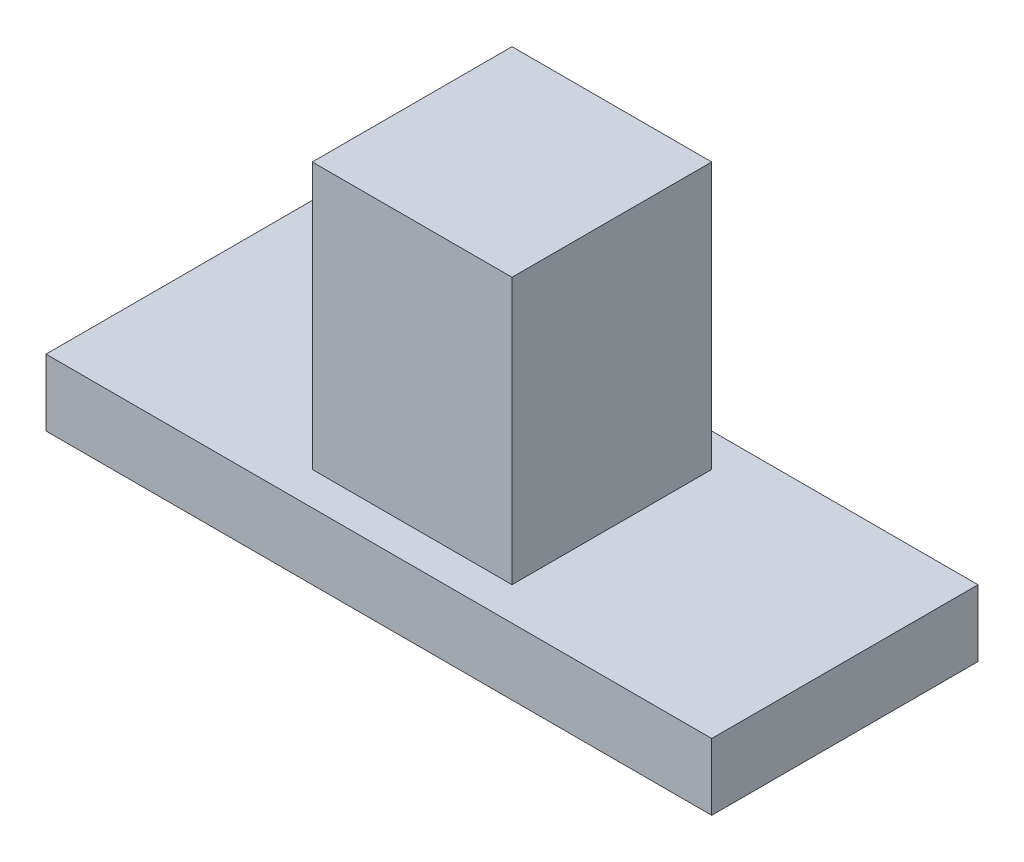
ISO-10303-21;
HEADER;
FILE_DESCRIPTION(('STEP AP214'),'2;1');
FILE_NAME('part.step','',(''),(''),'','','');
FILE_SCHEMA(('AUTOMOTIVE_DESIGN { 1 0 10303 214 1 1 1 1 }'));
ENDSEC;
DATA;
#1=APPLICATION_CONTEXT('core data for automotive mechanical design processes');
#2=APPLICATION_PROTOCOL_DEFINITION('international standard','automotive_design',2000,#1);
#3=PRODUCT_CONTEXT('',#1,'mechanical');
#4=PRODUCT('Part','Part','',(#3));
#5=PRODUCT_RELATED_PRODUCT_CATEGORY('part','',(#4));
#6=PRODUCT_DEFINITION_FORMATION('','',#4);
#7=PRODUCT_DEFINITION_CONTEXT('part definition',#1,'design');
#8=PRODUCT_DEFINITION('design','',#6,#7);
#9=PRODUCT_DEFINITION_SHAPE('','',#8);
#10=(LENGTH_UNIT() NAMED_UNIT(*) SI_UNIT(.MILLI.,.METRE.));
#11=(NAMED_UNIT(*) PLANE_ANGLE_UNIT() SI_UNIT($,.RADIAN.));
#12=(NAMED_UNIT(*) SI_UNIT($,.STERADIAN.) SOLID_ANGLE_UNIT());
#13=UNCERTAINTY_MEASURE_WITH_UNIT(LENGTH_MEASURE(1.E-05),#10,'distance_accuracy_value','');
#14=(GEOMETRIC_REPRESENTATION_CONTEXT(3) GLOBAL_UNCERTAINTY_ASSIGNED_CONTEXT((#13)) GLOBAL_UNIT_ASSIGNED_CONTEXT((#10,
#11,#12)) REPRESENTATION_CONTEXT('',''));
#15=CARTESIAN_POINT('',(0.,0.,0.));
#16=DIRECTION('',(0.,0.,1.));
#17=DIRECTION('',(1.,0.,0.));
#18=AXIS2_PLACEMENT_3D('',#15,#16,#17);
#19=CARTESIAN_POINT('',(0.,-1.,0.));
#20=DIRECTION('',(0.,-1.,0.));
#21=DIRECTION('',(0.,0.,-1.));
#22=AXIS2_PLACEMENT_3D('',#19,#20,#21);
#23=PLANE('',#22);
#24=DIRECTION('',(0.,0.,-1.));
#25=VECTOR('',#24,1.);
#26=CARTESIAN_POINT('',(-0.85,-1.,0.85));
#27=LINE('',#26,#25);
#28=CARTESIAN_POINT('',(-0.85,-1.,0.85));
#29=VERTEX_POINT('',#28);
#30=CARTESIAN_POINT('',(-0.849999999999999,-1.,-0.85));
#31=VERTEX_POINT('',#30);
#32=EDGE_CURVE('E50',#29,#31,#27,.T.);
#33=ORIENTED_EDGE('',*,*,#32,.F.);
#34=DIRECTION('',(-1.,0.,0.));
#35=VECTOR('',#34,1.);
#36=CARTESIAN_POINT('',(-0.85,-1.,0.85));
#37=LINE('',#36,#35);
#38=CARTESIAN_POINT('',(0.85,-1.,0.85));
#39=VERTEX_POINT('',#38);
#40=EDGE_CURVE('E143',#39,#29,#37,.T.);
#41=ORIENTED_EDGE('',*,*,#40,.F.);
#42=DIRECTION('',(0.,0.,1.));
#43=VECTOR('',#42,1.);
#44=CARTESIAN_POINT('',(0.85,-1.,0.85));
#45=LINE('',#44,#43);
#46=CARTESIAN_POINT('',(0.85,-1.,-0.85));
#47=VERTEX_POINT('',#46);
#48=EDGE_CURVE('E146',#47,#39,#45,.T.);
#49=ORIENTED_EDGE('',*,*,#48,.F.);
#50=DIRECTION('',(1.,0.,0.));
#51=VECTOR('',#50,1.);
#52=CARTESIAN_POINT('',(-0.849999999999999,-1.,-0.85));
#53=LINE('',#52,#51);
#54=EDGE_CURVE('E152',#31,#47,#53,.T.);
#55=ORIENTED_EDGE('',*,*,#54,.F.);
#56=EDGE_LOOP('',(#33,#41,#49,#55));
#57=FACE_BOUND('',#56,.T.);
#58=DIRECTION('',(0.,0.,-1.));
#59=VECTOR('',#58,1.);
#60=CARTESIAN_POINT('',(-5.,-1.,2.));
#61=LINE('',#60,#59);
#62=CARTESIAN_POINT('',(-5.,-1.,2.));
#63=VERTEX_POINT('',#62);
#64=CARTESIAN_POINT('',(-5.,-1.,-2.));
#65=VERTEX_POINT('',#64);
#66=EDGE_CURVE('E192',#63,#65,#61,.T.);
#67=ORIENTED_EDGE('',*,*,#66,.T.);
#68=DIRECTION('',(1.,0.,0.));
#69=VECTOR('',#68,1.);
#70=CARTESIAN_POINT('',(-5.,-1.,-2.));
#71=LINE('',#70,#69);
#72=CARTESIAN_POINT('',(5.,-1.,-2.));
#73=VERTEX_POINT('',#72);
#74=EDGE_CURVE('E195',#65,#73,#71,.T.);
#75=ORIENTED_EDGE('',*,*,#74,.T.);
#76=DIRECTION('',(0.,0.,1.));
#77=VECTOR('',#76,1.);
#78=CARTESIAN_POINT('',(5.,-1.,2.));
#79=LINE('',#78,#77);
#80=CARTESIAN_POINT('',(5.,-1.,2.));
#81=VERTEX_POINT('',#80);
#82=EDGE_CURVE('E198',#73,#81,#79,.T.);
#83=ORIENTED_EDGE('',*,*,#82,.T.);
#84=DIRECTION('',(-1.,0.,0.));
#85=VECTOR('',#84,1.);
#86=CARTESIAN_POINT('',(-5.,-1.,2.));
#87=LINE('',#86,#85);
#88=EDGE_CURVE('E201',#81,#63,#87,.T.);
#89=ORIENTED_EDGE('',*,*,#88,.T.);
#90=EDGE_LOOP('',(#67,#75,#83,#89));
#91=FACE_BOUND('',#90,.T.);
#92=ADVANCED_FACE('F35',(#57,#91),#23,.T.);
#93=CARTESIAN_POINT('',(-1.5,1.,-1.5));
#94=DIRECTION('',(1.,0.,0.));
#95=DIRECTION('',(0.,0.,-1.));
#96=AXIS2_PLACEMENT_3D('',#93,#94,#95);
#97=PLANE('',#96);
#98=DIRECTION('',(0.,-1.,0.));
#99=VECTOR('',#98,1.);
#100=CARTESIAN_POINT('',(-1.5,1.,-1.5));
#101=LINE('',#100,#99);
#102=CARTESIAN_POINT('',(-1.5,4.,-1.5));
#103=VERTEX_POINT('',#102);
#104=CARTESIAN_POINT('',(-1.5,0.,-1.5));
#105=VERTEX_POINT('',#104);
#106=EDGE_CURVE('E211',#103,#105,#101,.T.);
#107=ORIENTED_EDGE('',*,*,#106,.T.);
#108=DIRECTION('',(0.,0.,1.));
#109=VECTOR('',#108,1.);
#110=CARTESIAN_POINT('',(-1.5,0.,-1.5));
#111=LINE('',#110,#109);
#112=CARTESIAN_POINT('',(-1.5,0.,1.5));
#113=VERTEX_POINT('',#112);
#114=EDGE_CURVE('E179',#105,#113,#111,.T.);
#115=ORIENTED_EDGE('',*,*,#114,.T.);
#116=DIRECTION('',(0.,-1.,0.));
#117=VECTOR('',#116,1.);
#118=CARTESIAN_POINT('',(-1.5,1.,1.5));
#119=LINE('',#118,#117);
#120=CARTESIAN_POINT('',(-1.5,4.,1.5));
#121=VERTEX_POINT('',#120);
#122=EDGE_CURVE('E11',#121,#113,#119,.T.);
#123=ORIENTED_EDGE('',*,*,#122,.F.);
#124=DIRECTION('',(0.,0.,1.));
#125=VECTOR('',#124,1.);
#126=CARTESIAN_POINT('',(-1.5,4.,-1.5));
#127=LINE('',#126,#125);
#128=EDGE_CURVE('E158',#103,#121,#127,.T.);
#129=ORIENTED_EDGE('',*,*,#128,.F.);
#130=EDGE_LOOP('',(#107,#115,#123,#129));
#131=FACE_BOUND('',#130,.T.);
#132=ADVANCED_FACE('F229',(#131),#97,.F.);
#133=CARTESIAN_POINT('',(-1.5,1.,1.5));
#134=DIRECTION('',(0.,0.,-1.));
#135=DIRECTION('',(-1.,0.,0.));
#136=AXIS2_PLACEMENT_3D('',#133,#134,#135);
#137=PLANE('',#136);
#138=ORIENTED_EDGE('',*,*,#122,.T.);
#139=DIRECTION('',(1.,0.,0.));
#140=VECTOR('',#139,1.);
#141=CARTESIAN_POINT('',(1.5,0.,1.5));
#142=LINE('',#141,#140);
#143=CARTESIAN_POINT('',(1.5,0.,1.5));
#144=VERTEX_POINT('',#143);
#145=EDGE_CURVE('E182',#113,#144,#142,.T.);
#146=ORIENTED_EDGE('',*,*,#145,.T.);
#147=DIRECTION('',(0.,-1.,0.));
#148=VECTOR('',#147,1.);
#149=CARTESIAN_POINT('',(1.5,1.,1.5));
#150=LINE('',#149,#148);
#151=CARTESIAN_POINT('',(1.5,4.,1.5));
#152=VERTEX_POINT('',#151);
#153=EDGE_CURVE('E43',#152,#144,#150,.T.);
#154=ORIENTED_EDGE('',*,*,#153,.F.);
#155=DIRECTION('',(1.,0.,0.));
#156=VECTOR('',#155,1.);
#157=CARTESIAN_POINT('',(-1.5,4.,1.5));
#158=LINE('',#157,#156);
#159=EDGE_CURVE('E164',#121,#152,#158,.T.);
#160=ORIENTED_EDGE('',*,*,#159,.F.);
#161=EDGE_LOOP('',(#138,#146,#154,#160));
#162=FACE_BOUND('',#161,.T.);
#163=ADVANCED_FACE('F226',(#162),#137,.F.);
#164=CARTESIAN_POINT('',(1.5,1.,-1.5));
#165=DIRECTION('',(-1.,0.,0.));
#166=DIRECTION('',(0.,0.,1.));
#167=AXIS2_PLACEMENT_3D('',#164,#165,#166);
#168=PLANE('',#167);
#169=ORIENTED_EDGE('',*,*,#153,.T.);
#170=DIRECTION('',(0.,0.,-1.));
#171=VECTOR('',#170,1.);
#172=CARTESIAN_POINT('',(1.5,0.,-1.5));
#173=LINE('',#172,#171);
#174=CARTESIAN_POINT('',(1.5,0.,-1.5));
#175=VERTEX_POINT('',#174);
#176=EDGE_CURVE('E173',#144,#175,#173,.T.);
#177=ORIENTED_EDGE('',*,*,#176,.T.);
#178=DIRECTION('',(0.,-1.,0.));
#179=VECTOR('',#178,1.);
#180=CARTESIAN_POINT('',(1.5,1.,-1.5));
#181=LINE('',#180,#179);
#182=CARTESIAN_POINT('',(1.5,4.,-1.5));
#183=VERTEX_POINT('',#182);
#184=EDGE_CURVE('E214',#183,#175,#181,.T.);
#185=ORIENTED_EDGE('',*,*,#184,.F.);
#186=DIRECTION('',(0.,0.,-1.));
#187=VECTOR('',#186,1.);
#188=CARTESIAN_POINT('',(1.5,4.,-1.5));
#189=LINE('',#188,#187);
#190=EDGE_CURVE('E167',#152,#183,#189,.T.);
#191=ORIENTED_EDGE('',*,*,#190,.F.);
#192=EDGE_LOOP('',(#169,#177,#185,#191));
#193=FACE_BOUND('',#192,.T.);
#194=ADVANCED_FACE('F218',(#193),#168,.F.);
#195=CARTESIAN_POINT('',(-1.5,1.,-1.5));
#196=DIRECTION('',(0.,0.,1.));
#197=DIRECTION('',(1.,0.,0.));
#198=AXIS2_PLACEMENT_3D('',#195,#196,#197);
#199=PLANE('',#198);
#200=ORIENTED_EDGE('',*,*,#184,.T.);
#201=DIRECTION('',(-1.,0.,0.));
#202=VECTOR('',#201,1.);
#203=CARTESIAN_POINT('',(1.5,0.,-1.5));
#204=LINE('',#203,#202);
#205=EDGE_CURVE('E176',#175,#105,#204,.T.);
#206=ORIENTED_EDGE('',*,*,#205,.T.);
#207=ORIENTED_EDGE('',*,*,#106,.F.);
#208=DIRECTION('',(-1.,0.,0.));
#209=VECTOR('',#208,1.);
#210=CARTESIAN_POINT('',(-1.5,4.,-1.5));
#211=LINE('',#210,#209);
#212=EDGE_CURVE('E170',#183,#103,#211,.T.);
#213=ORIENTED_EDGE('',*,*,#212,.F.);
#214=EDGE_LOOP('',(#200,#206,#207,#213));
#215=FACE_BOUND('',#214,.T.);
#216=ADVANCED_FACE('F231',(#215),#199,.F.);
#217=CARTESIAN_POINT('',(0.,0.,0.));
#218=DIRECTION('',(0.,-1.,0.));
#219=DIRECTION('',(0.,0.,-1.));
#220=AXIS2_PLACEMENT_3D('',#217,#218,#219);
#221=PLANE('',#220);
#222=ORIENTED_EDGE('',*,*,#176,.F.);
#223=ORIENTED_EDGE('',*,*,#145,.F.);
#224=ORIENTED_EDGE('',*,*,#114,.F.);
#225=ORIENTED_EDGE('',*,*,#205,.F.);
#226=EDGE_LOOP('',(#222,#223,#224,#225));
#227=FACE_BOUND('',#226,.T.);
#228=DIRECTION('',(0.,0.,-1.));
#229=VECTOR('',#228,1.);
#230=CARTESIAN_POINT('',(5.,0.,-2.));
#231=LINE('',#230,#229);
#232=CARTESIAN_POINT('',(5.,0.,2.));
#233=VERTEX_POINT('',#232);
#234=CARTESIAN_POINT('',(5.,0.,-2.));
#235=VERTEX_POINT('',#234);
#236=EDGE_CURVE('E58',#233,#235,#231,.T.);
#237=ORIENTED_EDGE('',*,*,#236,.T.);
#238=DIRECTION('',(-1.,0.,0.));
#239=VECTOR('',#238,1.);
#240=CARTESIAN_POINT('',(5.,0.,-2.));
#241=LINE('',#240,#239);
#242=CARTESIAN_POINT('',(-5.,0.,-2.));
#243=VERTEX_POINT('',#242);
#244=EDGE_CURVE('E186',#235,#243,#241,.T.);
#245=ORIENTED_EDGE('',*,*,#244,.T.);
#246=DIRECTION('',(0.,0.,1.));
#247=VECTOR('',#246,1.);
#248=CARTESIAN_POINT('',(-5.,0.,-2.));
#249=LINE('',#248,#247);
#250=CARTESIAN_POINT('',(-5.,0.,2.));
#251=VERTEX_POINT('',#250);
#252=EDGE_CURVE('E188',#243,#251,#249,.T.);
#253=ORIENTED_EDGE('',*,*,#252,.T.);
#254=DIRECTION('',(1.,0.,0.));
#255=VECTOR('',#254,1.);
#256=CARTESIAN_POINT('',(5.,0.,2.));
#257=LINE('',#256,#255);
#258=EDGE_CURVE('E190',#251,#233,#257,.T.);
#259=ORIENTED_EDGE('',*,*,#258,.T.);
#260=EDGE_LOOP('',(#237,#245,#253,#259));
#261=FACE_BOUND('',#260,.T.);
#262=ADVANCED_FACE('F224',(#227,#261),#221,.F.);
#263=CARTESIAN_POINT('',(-5.,1.,2.));
#264=DIRECTION('',(0.,0.,-1.));
#265=DIRECTION('',(-1.,0.,0.));
#266=AXIS2_PLACEMENT_3D('',#263,#264,#265);
#267=PLANE('',#266);
#268=DIRECTION('',(0.,-1.,0.));
#269=VECTOR('',#268,1.);
#270=CARTESIAN_POINT('',(5.,1.,2.));
#271=LINE('',#270,#269);
#272=EDGE_CURVE('E207',#233,#81,#271,.T.);
#273=ORIENTED_EDGE('',*,*,#272,.F.);
#274=ORIENTED_EDGE('',*,*,#258,.F.);
#275=DIRECTION('',(0.,-1.,0.));
#276=VECTOR('',#275,1.);
#277=CARTESIAN_POINT('',(-5.,1.,2.));
#278=LINE('',#277,#276);
#279=EDGE_CURVE('E209',#251,#63,#278,.T.);
#280=ORIENTED_EDGE('',*,*,#279,.T.);
#281=ORIENTED_EDGE('',*,*,#88,.F.);
#282=EDGE_LOOP('',(#273,#274,#280,#281));
#283=FACE_BOUND('',#282,.T.);
#284=ADVANCED_FACE('F260',(#283),#267,.F.);
#285=CARTESIAN_POINT('',(-5.,1.,-2.));
#286=DIRECTION('',(0.,0.,1.));
#287=DIRECTION('',(1.,0.,0.));
#288=AXIS2_PLACEMENT_3D('',#285,#286,#287);
#289=PLANE('',#288);
#290=DIRECTION('',(0.,-1.,0.));
#291=VECTOR('',#290,1.);
#292=CARTESIAN_POINT('',(-5.,1.,-2.));
#293=LINE('',#292,#291);
#294=EDGE_CURVE('E205',#243,#65,#293,.T.);
#295=ORIENTED_EDGE('',*,*,#294,.F.);
#296=ORIENTED_EDGE('',*,*,#244,.F.);
#297=DIRECTION('',(0.,-1.,0.));
#298=VECTOR('',#297,1.);
#299=CARTESIAN_POINT('',(5.,1.,-2.));
#300=LINE('',#299,#298);
#301=EDGE_CURVE('E204',#235,#73,#300,.T.);
#302=ORIENTED_EDGE('',*,*,#301,.T.);
#303=ORIENTED_EDGE('',*,*,#74,.F.);
#304=EDGE_LOOP('',(#295,#296,#302,#303));
#305=FACE_BOUND('',#304,.T.);
#306=ADVANCED_FACE('F257',(#305),#289,.F.);
#307=CARTESIAN_POINT('',(5.,0.5,-2.5));
#308=DIRECTION('',(-1.,0.,0.));
#309=DIRECTION('',(0.,0.,1.));
#310=AXIS2_PLACEMENT_3D('',#307,#308,#309);
#311=PLANE('',#310);
#312=ORIENTED_EDGE('',*,*,#301,.F.);
#313=ORIENTED_EDGE('',*,*,#236,.F.);
#314=ORIENTED_EDGE('',*,*,#272,.T.);
#315=ORIENTED_EDGE('',*,*,#82,.F.);
#316=EDGE_LOOP('',(#312,#313,#314,#315));
#317=FACE_BOUND('',#316,.T.);
#318=ADVANCED_FACE('F244',(#317),#311,.F.);
#319=CARTESIAN_POINT('',(-5.,0.5,-2.5));
#320=DIRECTION('',(1.,0.,0.));
#321=DIRECTION('',(0.,0.,-1.));
#322=AXIS2_PLACEMENT_3D('',#319,#320,#321);
#323=PLANE('',#322);
#324=ORIENTED_EDGE('',*,*,#279,.F.);
#325=ORIENTED_EDGE('',*,*,#252,.F.);
#326=ORIENTED_EDGE('',*,*,#294,.T.);
#327=ORIENTED_EDGE('',*,*,#66,.F.);
#328=EDGE_LOOP('',(#324,#325,#326,#327));
#329=FACE_BOUND('',#328,.T.);
#330=ADVANCED_FACE('F37',(#329),#323,.F.);
#331=CARTESIAN_POINT('',(0.,4.,0.));
#332=DIRECTION('',(0.,1.,0.));
#333=DIRECTION('',(0.,0.,1.));
#334=AXIS2_PLACEMENT_3D('',#331,#332,#333);
#335=PLANE('',#334);
#336=ORIENTED_EDGE('',*,*,#128,.T.);
#337=ORIENTED_EDGE('',*,*,#159,.T.);
#338=ORIENTED_EDGE('',*,*,#190,.T.);
#339=ORIENTED_EDGE('',*,*,#212,.T.);
#340=EDGE_LOOP('',(#336,#337,#338,#339));
#341=FACE_BOUND('',#340,.T.);
#342=ADVANCED_FACE('F234',(#341),#335,.T.);
#343=CARTESIAN_POINT('',(-0.85,3.,0.85));
#344=DIRECTION('',(-1.,0.,0.));
#345=DIRECTION('',(0.,0.,1.));
#346=AXIS2_PLACEMENT_3D('',#343,#344,#345);
#347=PLANE('',#346);
#348=ORIENTED_EDGE('',*,*,#32,.T.);
#349=DIRECTION('',(0.,-1.,0.));
#350=VECTOR('',#349,1.);
#351=CARTESIAN_POINT('',(-0.849999999999999,3.,-0.85));
#352=LINE('',#351,#350);
#353=CARTESIAN_POINT('',(-0.849999999999999,3.,-0.85));
#354=VERTEX_POINT('',#353);
#355=EDGE_CURVE('E121',#354,#31,#352,.T.);
#356=ORIENTED_EDGE('',*,*,#355,.F.);
#357=DIRECTION('',(0.,0.,-1.));
#358=VECTOR('',#357,1.);
#359=CARTESIAN_POINT('',(-0.85,3.,0.85));
#360=LINE('',#359,#358);
#361=CARTESIAN_POINT('',(-0.85,3.,0.85));
#362=VERTEX_POINT('',#361);
#363=EDGE_CURVE('E125',#362,#354,#360,.T.);
#364=ORIENTED_EDGE('',*,*,#363,.F.);
#365=DIRECTION('',(0.,-1.,0.));
#366=VECTOR('',#365,1.);
#367=CARTESIAN_POINT('',(-0.85,3.,0.85));
#368=LINE('',#367,#366);
#369=EDGE_CURVE('E156',#362,#29,#368,.T.);
#370=ORIENTED_EDGE('',*,*,#369,.T.);
#371=EDGE_LOOP('',(#348,#356,#364,#370));
#372=FACE_BOUND('',#371,.T.);
#373=ADVANCED_FACE('F123',(#372),#347,.F.);
#374=CARTESIAN_POINT('',(-0.85,3.,0.85));
#375=DIRECTION('',(0.,0.,1.));
#376=DIRECTION('',(1.,0.,0.));
#377=AXIS2_PLACEMENT_3D('',#374,#375,#376);
#378=PLANE('',#377);
#379=ORIENTED_EDGE('',*,*,#40,.T.);
#380=ORIENTED_EDGE('',*,*,#369,.F.);
#381=DIRECTION('',(-1.,0.,0.));
#382=VECTOR('',#381,1.);
#383=CARTESIAN_POINT('',(-0.85,3.,0.85));
#384=LINE('',#383,#382);
#385=CARTESIAN_POINT('',(0.85,3.,0.85));
#386=VERTEX_POINT('',#385);
#387=EDGE_CURVE('E131',#386,#362,#384,.T.);
#388=ORIENTED_EDGE('',*,*,#387,.F.);
#389=DIRECTION('',(0.,-1.,0.));
#390=VECTOR('',#389,1.);
#391=CARTESIAN_POINT('',(0.85,3.,0.85));
#392=LINE('',#391,#390);
#393=EDGE_CURVE('E159',#386,#39,#392,.T.);
#394=ORIENTED_EDGE('',*,*,#393,.T.);
#395=EDGE_LOOP('',(#379,#380,#388,#394));
#396=FACE_BOUND('',#395,.T.);
#397=ADVANCED_FACE('F241',(#396),#378,.F.);
#398=CARTESIAN_POINT('',(0.85,3.,0.85));
#399=DIRECTION('',(1.,0.,0.));
#400=DIRECTION('',(0.,0.,-1.));
#401=AXIS2_PLACEMENT_3D('',#398,#399,#400);
#402=PLANE('',#401);
#403=ORIENTED_EDGE('',*,*,#48,.T.);
#404=ORIENTED_EDGE('',*,*,#393,.F.);
#405=DIRECTION('',(0.,0.,1.));
#406=VECTOR('',#405,1.);
#407=CARTESIAN_POINT('',(0.85,3.,0.85));
#408=LINE('',#407,#406);
#409=CARTESIAN_POINT('',(0.85,3.,-0.85));
#410=VERTEX_POINT('',#409);
#411=EDGE_CURVE('E139',#410,#386,#408,.T.);
#412=ORIENTED_EDGE('',*,*,#411,.F.);
#413=DIRECTION('',(0.,-1.,0.));
#414=VECTOR('',#413,1.);
#415=CARTESIAN_POINT('',(0.85,3.,-0.85));
#416=LINE('',#415,#414);
#417=EDGE_CURVE('E130',#410,#47,#416,.T.);
#418=ORIENTED_EDGE('',*,*,#417,.T.);
#419=EDGE_LOOP('',(#403,#404,#412,#418));
#420=FACE_BOUND('',#419,.T.);
#421=ADVANCED_FACE('F355',(#420),#402,.F.);
#422=CARTESIAN_POINT('',(-0.849999999999999,3.,-0.85));
#423=DIRECTION('',(0.,0.,-1.));
#424=DIRECTION('',(-1.,0.,0.));
#425=AXIS2_PLACEMENT_3D('',#422,#423,#424);
#426=PLANE('',#425);
#427=ORIENTED_EDGE('',*,*,#54,.T.);
#428=ORIENTED_EDGE('',*,*,#417,.F.);
#429=DIRECTION('',(1.,0.,0.));
#430=VECTOR('',#429,1.);
#431=CARTESIAN_POINT('',(-0.849999999999999,3.,-0.85));
#432=LINE('',#431,#430);
#433=EDGE_CURVE('E134',#354,#410,#432,.T.);
#434=ORIENTED_EDGE('',*,*,#433,.F.);
#435=ORIENTED_EDGE('',*,*,#355,.T.);
#436=EDGE_LOOP('',(#427,#428,#434,#435));
#437=FACE_BOUND('',#436,.T.);
#438=ADVANCED_FACE('F135',(#437),#426,.F.);
#439=CARTESIAN_POINT('',(0.,3.,0.));
#440=DIRECTION('',(0.,-1.,0.));
#441=DIRECTION('',(0.,0.,-1.));
#442=AXIS2_PLACEMENT_3D('',#439,#440,#441);
#443=PLANE('',#442);
#444=ORIENTED_EDGE('',*,*,#363,.T.);
#445=ORIENTED_EDGE('',*,*,#433,.T.);
#446=ORIENTED_EDGE('',*,*,#411,.T.);
#447=ORIENTED_EDGE('',*,*,#387,.T.);
#448=EDGE_LOOP('',(#444,#445,#446,#447));
#449=FACE_BOUND('',#448,.T.);
#450=ADVANCED_FACE('F141',(#449),#443,.T.);
#451=CLOSED_SHELL('',(#92,#132,#163,#194,#216,#262,#284,#306,#318,#330,#342,#373,#397,#421,#438,#450));
#452=MANIFOLD_SOLID_BREP('B2',#451);
#453=ADVANCED_BREP_SHAPE_REPRESENTATION('',(#18,#452),#14);
#454=SHAPE_DEFINITION_REPRESENTATION(#9,#453);
ENDSEC;
END-ISO-10303-21;
